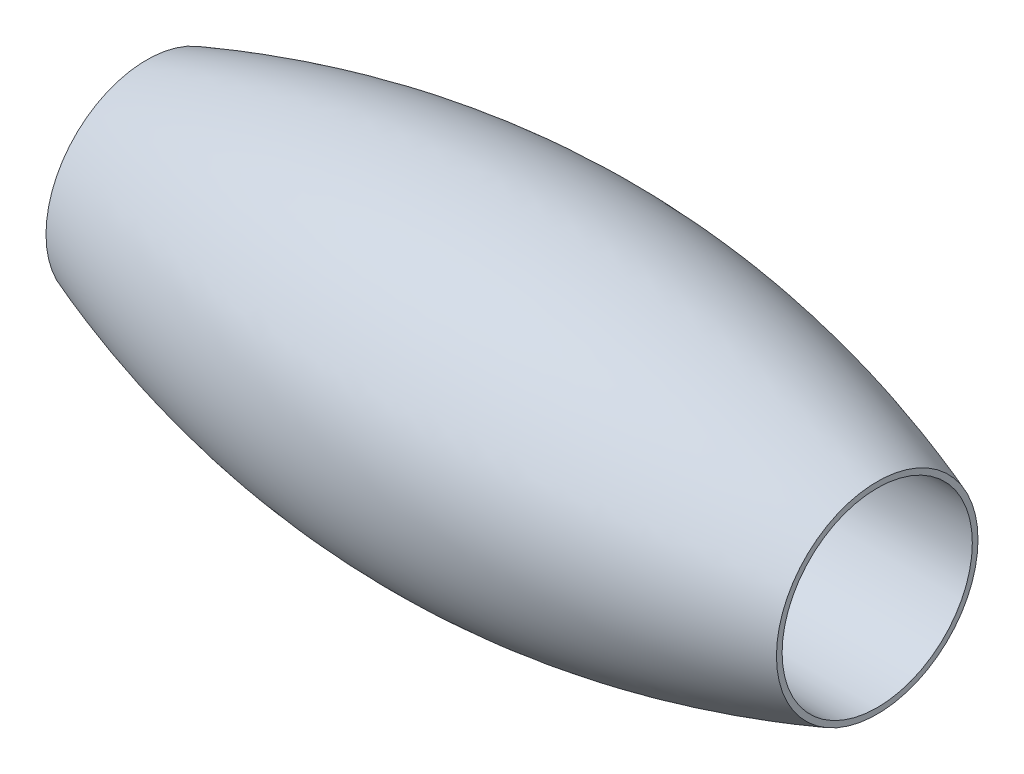
ISO-10303-21;
HEADER;
FILE_DESCRIPTION(('STEP AP214'),'2;1');
FILE_NAME('part.step','',(''),(''),'','','');
FILE_SCHEMA(('AUTOMOTIVE_DESIGN { 1 0 10303 214 1 1 1 1 }'));
ENDSEC;
DATA;
#1=APPLICATION_CONTEXT('core data for automotive mechanical design processes');
#2=APPLICATION_PROTOCOL_DEFINITION('international standard','automotive_design',2000,#1);
#3=PRODUCT_CONTEXT('',#1,'mechanical');
#4=PRODUCT('Part','Part','',(#3));
#5=PRODUCT_RELATED_PRODUCT_CATEGORY('part','',(#4));
#6=PRODUCT_DEFINITION_FORMATION('','',#4);
#7=PRODUCT_DEFINITION_CONTEXT('part definition',#1,'design');
#8=PRODUCT_DEFINITION('design','',#6,#7);
#9=PRODUCT_DEFINITION_SHAPE('','',#8);
#10=(LENGTH_UNIT() NAMED_UNIT(*) SI_UNIT(.MILLI.,.METRE.));
#11=(NAMED_UNIT(*) PLANE_ANGLE_UNIT() SI_UNIT($,.RADIAN.));
#12=(NAMED_UNIT(*) SI_UNIT($,.STERADIAN.) SOLID_ANGLE_UNIT());
#13=UNCERTAINTY_MEASURE_WITH_UNIT(LENGTH_MEASURE(1.E-05),#10,'distance_accuracy_value','');
#14=(GEOMETRIC_REPRESENTATION_CONTEXT(3) GLOBAL_UNCERTAINTY_ASSIGNED_CONTEXT((#13)) GLOBAL_UNIT_ASSIGNED_CONTEXT((#10,
#11,#12)) REPRESENTATION_CONTEXT('',''));
#15=CARTESIAN_POINT('',(0.,0.,0.));
#16=DIRECTION('',(0.,0.,1.));
#17=DIRECTION('',(1.,0.,0.));
#18=AXIS2_PLACEMENT_3D('',#15,#16,#17);
#19=CARTESIAN_POINT('',(0.,1.5875,0.));
#20=CARTESIAN_POINT('',(6.35,4.0005,0.));
#21=CARTESIAN_POINT('',(12.7,1.5875,0.));
#22=B_SPLINE_CURVE_WITH_KNOTS('',2,(#19,#20,#21),.UNSPECIFIED.,.F.,.F.,(3,3),(0.,1.),.UNSPECIFIED.);
#23=CARTESIAN_POINT('',(0.,0.,0.));
#24=DIRECTION('',(-1.,0.,0.));
#25=AXIS1_PLACEMENT('',#23,#24);
#26=SURFACE_OF_REVOLUTION('',#22,#25);
#27=CARTESIAN_POINT('',(12.446,0.,0.));
#28=DIRECTION('',(-1.,0.,0.));
#29=DIRECTION('',(0.,0.,1.));
#30=AXIS2_PLACEMENT_3D('',#27,#28,#29);
#31=CIRCLE('',#30,1.6820896);
#32=CARTESIAN_POINT('',(12.446,0.,1.6820896));
#33=VERTEX_POINT('',#32);
#34=EDGE_CURVE('E54',#33,#33,#31,.T.);
#35=ORIENTED_EDGE('',*,*,#34,.T.);
#36=EDGE_LOOP('',(#35));
#37=FACE_BOUND('',#36,.T.);
#38=CARTESIAN_POINT('',(0.254,0.,0.));
#39=DIRECTION('',(-1.,0.,0.));
#40=DIRECTION('',(0.,0.,1.));
#41=AXIS2_PLACEMENT_3D('',#38,#39,#40);
#42=CIRCLE('',#41,1.6820896);
#43=CARTESIAN_POINT('',(0.254,0.,1.6820896));
#44=VERTEX_POINT('',#43);
#45=EDGE_CURVE('E10',#44,#44,#42,.T.);
#46=ORIENTED_EDGE('',*,*,#45,.F.);
#47=EDGE_LOOP('',(#46));
#48=FACE_BOUND('',#47,.T.);
#49=ADVANCED_FACE('F39',(#37,#48),#26,.F.);
#50=CARTESIAN_POINT('',(0.254,0.,0.));
#51=DIRECTION('',(-1.,0.,0.));
#52=DIRECTION('',(0.,0.,1.));
#53=AXIS2_PLACEMENT_3D('',#50,#51,#52);
#54=PLANE('',#53);
#55=ORIENTED_EDGE('',*,*,#45,.T.);
#56=EDGE_LOOP('',(#55));
#57=FACE_BOUND('',#56,.T.);
#58=CARTESIAN_POINT('',(0.254,0.,0.));
#59=DIRECTION('',(-1.,0.,0.));
#60=DIRECTION('',(0.,0.,1.));
#61=AXIS2_PLACEMENT_3D('',#58,#59,#60);
#62=CIRCLE('',#61,1.5875);
#63=CARTESIAN_POINT('',(0.254,0.,1.5875));
#64=VERTEX_POINT('',#63);
#65=EDGE_CURVE('E46',#64,#64,#62,.T.);
#66=ORIENTED_EDGE('',*,*,#65,.F.);
#67=EDGE_LOOP('',(#66));
#68=FACE_BOUND('',#67,.T.);
#69=ADVANCED_FACE('F76',(#57,#68),#54,.T.);
#70=CARTESIAN_POINT('',(0.,0.,0.));
#71=DIRECTION('',(-1.,0.,0.));
#72=DIRECTION('',(0.,0.,1.));
#73=AXIS2_PLACEMENT_3D('',#70,#71,#72);
#74=CYLINDRICAL_SURFACE('',#73,1.5875);
#75=ORIENTED_EDGE('',*,*,#65,.T.);
#76=EDGE_LOOP('',(#75));
#77=FACE_BOUND('',#76,.T.);
#78=CARTESIAN_POINT('',(12.446,0.,0.));
#79=DIRECTION('',(-1.,0.,0.));
#80=DIRECTION('',(0.,0.,1.));
#81=AXIS2_PLACEMENT_3D('',#78,#79,#80);
#82=CIRCLE('',#81,1.5875);
#83=CARTESIAN_POINT('',(12.446,0.,1.5875));
#84=VERTEX_POINT('',#83);
#85=EDGE_CURVE('E50',#84,#84,#82,.T.);
#86=ORIENTED_EDGE('',*,*,#85,.F.);
#87=EDGE_LOOP('',(#86));
#88=FACE_BOUND('',#87,.T.);
#89=ADVANCED_FACE('F71',(#77,#88),#74,.F.);
#90=CARTESIAN_POINT('',(12.446,0.,0.));
#91=DIRECTION('',(-1.,0.,0.));
#92=DIRECTION('',(0.,0.,1.));
#93=AXIS2_PLACEMENT_3D('',#90,#91,#92);
#94=PLANE('',#93);
#95=ORIENTED_EDGE('',*,*,#34,.F.);
#96=EDGE_LOOP('',(#95));
#97=FACE_BOUND('',#96,.T.);
#98=ORIENTED_EDGE('',*,*,#85,.T.);
#99=EDGE_LOOP('',(#98));
#100=FACE_BOUND('',#99,.T.);
#101=ADVANCED_FACE('F68',(#97,#100),#94,.F.);
#102=CLOSED_SHELL('',(#49,#69,#89,#101));
#103=MANIFOLD_SOLID_BREP('B2',#102);
#104=ADVANCED_BREP_SHAPE_REPRESENTATION('',(#18,#103),#14);
#105=SHAPE_DEFINITION_REPRESENTATION(#9,#104);
ENDSEC;
END-ISO-10303-21;
